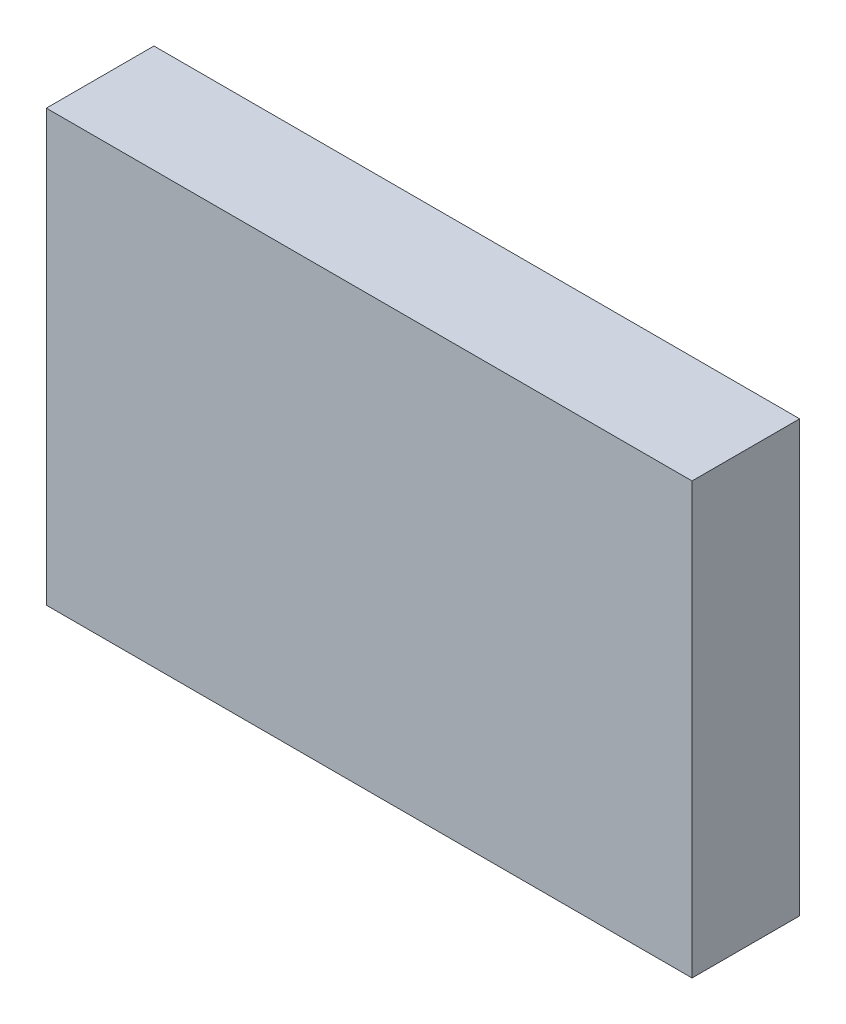
ISO-10303-21;
HEADER;
FILE_DESCRIPTION(('STEP AP214'),'2;1');
FILE_NAME('part.step','',(''),(''),'','','');
FILE_SCHEMA(('AUTOMOTIVE_DESIGN { 1 0 10303 214 1 1 1 1 }'));
ENDSEC;
DATA;
#1=APPLICATION_CONTEXT('core data for automotive mechanical design processes');
#2=APPLICATION_PROTOCOL_DEFINITION('international standard','automotive_design',2000,#1);
#3=PRODUCT_CONTEXT('',#1,'mechanical');
#4=PRODUCT('Part','Part','',(#3));
#5=PRODUCT_RELATED_PRODUCT_CATEGORY('part','',(#4));
#6=PRODUCT_DEFINITION_FORMATION('','',#4);
#7=PRODUCT_DEFINITION_CONTEXT('part definition',#1,'design');
#8=PRODUCT_DEFINITION('design','',#6,#7);
#9=PRODUCT_DEFINITION_SHAPE('','',#8);
#10=(LENGTH_UNIT() NAMED_UNIT(*) SI_UNIT(.MILLI.,.METRE.));
#11=(NAMED_UNIT(*) PLANE_ANGLE_UNIT() SI_UNIT($,.RADIAN.));
#12=(NAMED_UNIT(*) SI_UNIT($,.STERADIAN.) SOLID_ANGLE_UNIT());
#13=UNCERTAINTY_MEASURE_WITH_UNIT(LENGTH_MEASURE(1.E-05),#10,'distance_accuracy_value','');
#14=(GEOMETRIC_REPRESENTATION_CONTEXT(3) GLOBAL_UNCERTAINTY_ASSIGNED_CONTEXT((#13)) GLOBAL_UNIT_ASSIGNED_CONTEXT((#10,
#11,#12)) REPRESENTATION_CONTEXT('',''));
#15=CARTESIAN_POINT('',(0.,0.,0.));
#16=DIRECTION('',(0.,0.,1.));
#17=DIRECTION('',(1.,0.,0.));
#18=AXIS2_PLACEMENT_3D('',#15,#16,#17);
#19=CARTESIAN_POINT('',(0.,0.,5.));
#20=DIRECTION('',(1.,0.,0.));
#21=DIRECTION('',(0.,0.,-1.));
#22=AXIS2_PLACEMENT_3D('',#19,#20,#21);
#23=PLANE('',#22);
#24=DIRECTION('',(0.,-1.,0.));
#25=VECTOR('',#24,1.);
#26=CARTESIAN_POINT('',(0.,0.,0.));
#27=LINE('',#26,#25);
#28=CARTESIAN_POINT('',(0.,20.,0.));
#29=VERTEX_POINT('',#28);
#30=CARTESIAN_POINT('',(0.,0.,0.));
#31=VERTEX_POINT('',#30);
#32=EDGE_CURVE('E96',#29,#31,#27,.T.);
#33=ORIENTED_EDGE('',*,*,#32,.T.);
#34=DIRECTION('',(0.,0.,-1.));
#35=VECTOR('',#34,1.);
#36=CARTESIAN_POINT('',(0.,0.,5.));
#37=LINE('',#36,#35);
#38=CARTESIAN_POINT('',(0.,0.,5.));
#39=VERTEX_POINT('',#38);
#40=EDGE_CURVE('E11',#39,#31,#37,.T.);
#41=ORIENTED_EDGE('',*,*,#40,.F.);
#42=DIRECTION('',(0.,-1.,0.));
#43=VECTOR('',#42,1.);
#44=CARTESIAN_POINT('',(0.,0.,5.));
#45=LINE('',#44,#43);
#46=CARTESIAN_POINT('',(0.,20.,5.));
#47=VERTEX_POINT('',#46);
#48=EDGE_CURVE('E84',#47,#39,#45,.T.);
#49=ORIENTED_EDGE('',*,*,#48,.F.);
#50=DIRECTION('',(0.,0.,-1.));
#51=VECTOR('',#50,1.);
#52=CARTESIAN_POINT('',(0.,20.,5.));
#53=LINE('',#52,#51);
#54=EDGE_CURVE('E92',#47,#29,#53,.T.);
#55=ORIENTED_EDGE('',*,*,#54,.T.);
#56=EDGE_LOOP('',(#33,#41,#49,#55));
#57=FACE_BOUND('',#56,.T.);
#58=ADVANCED_FACE('F33',(#57),#23,.F.);
#59=CARTESIAN_POINT('',(0.,0.,5.));
#60=DIRECTION('',(0.,1.,0.));
#61=DIRECTION('',(0.,0.,1.));
#62=AXIS2_PLACEMENT_3D('',#59,#60,#61);
#63=PLANE('',#62);
#64=DIRECTION('',(1.,0.,0.));
#65=VECTOR('',#64,1.);
#66=CARTESIAN_POINT('',(0.,0.,0.));
#67=LINE('',#66,#65);
#68=CARTESIAN_POINT('',(30.,0.,0.));
#69=VERTEX_POINT('',#68);
#70=EDGE_CURVE('E88',#31,#69,#67,.T.);
#71=ORIENTED_EDGE('',*,*,#70,.T.);
#72=DIRECTION('',(0.,0.,-1.));
#73=VECTOR('',#72,1.);
#74=CARTESIAN_POINT('',(30.,0.,5.));
#75=LINE('',#74,#73);
#76=CARTESIAN_POINT('',(30.,0.,5.));
#77=VERTEX_POINT('',#76);
#78=EDGE_CURVE('E41',#77,#69,#75,.T.);
#79=ORIENTED_EDGE('',*,*,#78,.F.);
#80=DIRECTION('',(1.,0.,0.));
#81=VECTOR('',#80,1.);
#82=CARTESIAN_POINT('',(0.,0.,5.));
#83=LINE('',#82,#81);
#84=EDGE_CURVE('E79',#39,#77,#83,.T.);
#85=ORIENTED_EDGE('',*,*,#84,.F.);
#86=ORIENTED_EDGE('',*,*,#40,.T.);
#87=EDGE_LOOP('',(#71,#79,#85,#86));
#88=FACE_BOUND('',#87,.T.);
#89=ADVANCED_FACE('F87',(#88),#63,.F.);
#90=CARTESIAN_POINT('',(30.,0.,5.));
#91=DIRECTION('',(-1.,0.,0.));
#92=DIRECTION('',(0.,-1.,0.));
#93=AXIS2_PLACEMENT_3D('',#90,#91,#92);
#94=PLANE('',#93);
#95=DIRECTION('',(0.,1.,0.));
#96=VECTOR('',#95,1.);
#97=CARTESIAN_POINT('',(30.,0.,0.));
#98=LINE('',#97,#96);
#99=CARTESIAN_POINT('',(30.,20.,0.));
#100=VERTEX_POINT('',#99);
#101=EDGE_CURVE('E66',#69,#100,#98,.T.);
#102=ORIENTED_EDGE('',*,*,#101,.T.);
#103=DIRECTION('',(0.,0.,-1.));
#104=VECTOR('',#103,1.);
#105=CARTESIAN_POINT('',(30.,20.,5.));
#106=LINE('',#105,#104);
#107=CARTESIAN_POINT('',(30.,20.,5.));
#108=VERTEX_POINT('',#107);
#109=EDGE_CURVE('E89',#108,#100,#106,.T.);
#110=ORIENTED_EDGE('',*,*,#109,.F.);
#111=DIRECTION('',(0.,1.,0.));
#112=VECTOR('',#111,1.);
#113=CARTESIAN_POINT('',(30.,0.,5.));
#114=LINE('',#113,#112);
#115=EDGE_CURVE('E82',#77,#108,#114,.T.);
#116=ORIENTED_EDGE('',*,*,#115,.F.);
#117=ORIENTED_EDGE('',*,*,#78,.T.);
#118=EDGE_LOOP('',(#102,#110,#116,#117));
#119=FACE_BOUND('',#118,.T.);
#120=ADVANCED_FACE('F90',(#119),#94,.F.);
#121=CARTESIAN_POINT('',(0.,20.,5.));
#122=DIRECTION('',(0.,-1.,0.));
#123=DIRECTION('',(0.,0.,-1.));
#124=AXIS2_PLACEMENT_3D('',#121,#122,#123);
#125=PLANE('',#124);
#126=DIRECTION('',(-1.,0.,0.));
#127=VECTOR('',#126,1.);
#128=CARTESIAN_POINT('',(0.,20.,0.));
#129=LINE('',#128,#127);
#130=EDGE_CURVE('E72',#100,#29,#129,.T.);
#131=ORIENTED_EDGE('',*,*,#130,.T.);
#132=ORIENTED_EDGE('',*,*,#54,.F.);
#133=DIRECTION('',(-1.,0.,0.));
#134=VECTOR('',#133,1.);
#135=CARTESIAN_POINT('',(0.,20.,5.));
#136=LINE('',#135,#134);
#137=EDGE_CURVE('E49',#108,#47,#136,.T.);
#138=ORIENTED_EDGE('',*,*,#137,.F.);
#139=ORIENTED_EDGE('',*,*,#109,.T.);
#140=EDGE_LOOP('',(#131,#132,#138,#139));
#141=FACE_BOUND('',#140,.T.);
#142=ADVANCED_FACE('F103',(#141),#125,.F.);
#143=CARTESIAN_POINT('',(0.,0.,5.));
#144=DIRECTION('',(0.,0.,-1.));
#145=DIRECTION('',(-1.,0.,0.));
#146=AXIS2_PLACEMENT_3D('',#143,#144,#145);
#147=PLANE('',#146);
#148=ORIENTED_EDGE('',*,*,#48,.T.);
#149=ORIENTED_EDGE('',*,*,#84,.T.);
#150=ORIENTED_EDGE('',*,*,#115,.T.);
#151=ORIENTED_EDGE('',*,*,#137,.T.);
#152=EDGE_LOOP('',(#148,#149,#150,#151));
#153=FACE_BOUND('',#152,.T.);
#154=ADVANCED_FACE('F80',(#153),#147,.F.);
#155=CARTESIAN_POINT('',(0.,0.,0.));
#156=DIRECTION('',(0.,0.,-1.));
#157=DIRECTION('',(-1.,0.,0.));
#158=AXIS2_PLACEMENT_3D('',#155,#156,#157);
#159=PLANE('',#158);
#160=ORIENTED_EDGE('',*,*,#32,.F.);
#161=ORIENTED_EDGE('',*,*,#130,.F.);
#162=ORIENTED_EDGE('',*,*,#101,.F.);
#163=ORIENTED_EDGE('',*,*,#70,.F.);
#164=EDGE_LOOP('',(#160,#161,#162,#163));
#165=FACE_BOUND('',#164,.T.);
#166=ADVANCED_FACE('F106',(#165),#159,.T.);
#167=CLOSED_SHELL('',(#58,#89,#120,#142,#154,#166));
#168=MANIFOLD_SOLID_BREP('B2',#167);
#169=ADVANCED_BREP_SHAPE_REPRESENTATION('',(#18,#168),#14);
#170=SHAPE_DEFINITION_REPRESENTATION(#9,#169);
ENDSEC;
END-ISO-10303-21;
